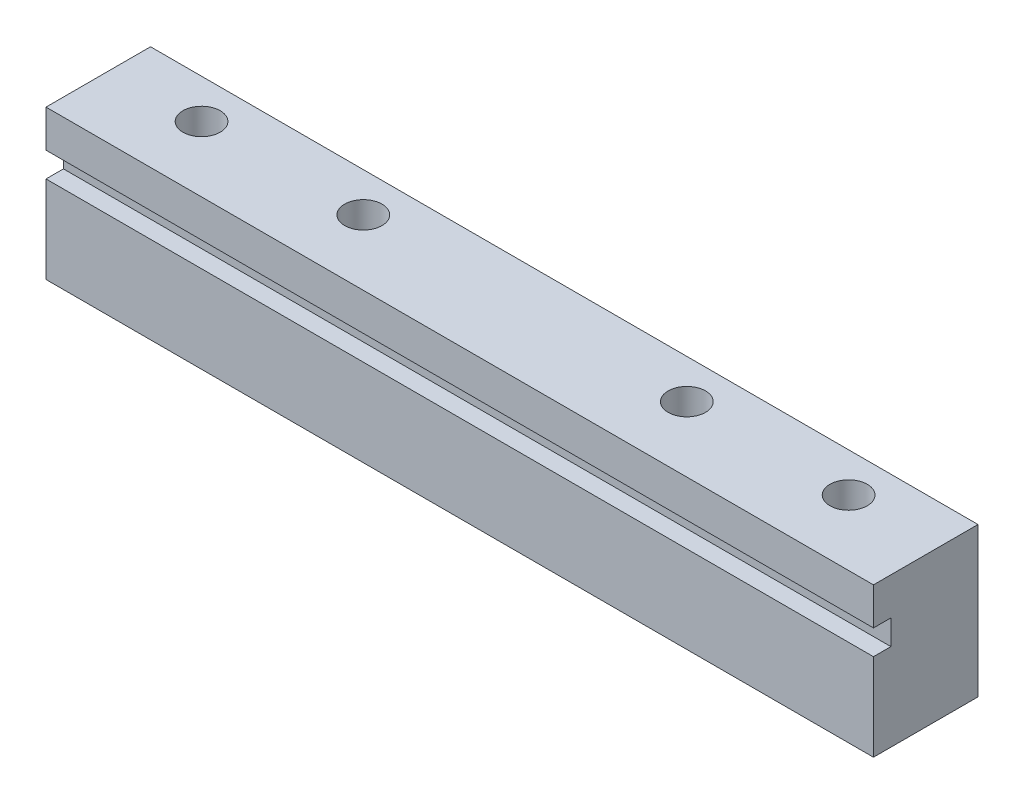
ISO-10303-21;
HEADER;
FILE_DESCRIPTION(('STEP AP214'),'2;1');
FILE_NAME('part.step','',(''),(''),'','','');
FILE_SCHEMA(('AUTOMOTIVE_DESIGN { 1 0 10303 214 1 1 1 1 }'));
ENDSEC;
DATA;
#1=APPLICATION_CONTEXT('core data for automotive mechanical design processes');
#2=APPLICATION_PROTOCOL_DEFINITION('international standard','automotive_design',2000,#1);
#3=PRODUCT_CONTEXT('',#1,'mechanical');
#4=PRODUCT('Part','Part','',(#3));
#5=PRODUCT_RELATED_PRODUCT_CATEGORY('part','',(#4));
#6=PRODUCT_DEFINITION_FORMATION('','',#4);
#7=PRODUCT_DEFINITION_CONTEXT('part definition',#1,'design');
#8=PRODUCT_DEFINITION('design','',#6,#7);
#9=PRODUCT_DEFINITION_SHAPE('','',#8);
#10=(LENGTH_UNIT() NAMED_UNIT(*) SI_UNIT(.MILLI.,.METRE.));
#11=(NAMED_UNIT(*) PLANE_ANGLE_UNIT() SI_UNIT($,.RADIAN.));
#12=(NAMED_UNIT(*) SI_UNIT($,.STERADIAN.) SOLID_ANGLE_UNIT());
#13=UNCERTAINTY_MEASURE_WITH_UNIT(LENGTH_MEASURE(1.E-05),#10,'distance_accuracy_value','');
#14=(GEOMETRIC_REPRESENTATION_CONTEXT(3) GLOBAL_UNCERTAINTY_ASSIGNED_CONTEXT((#13)) GLOBAL_UNIT_ASSIGNED_CONTEXT((#10,
#11,#12)) REPRESENTATION_CONTEXT('',''));
#15=CARTESIAN_POINT('',(0.,0.,0.));
#16=DIRECTION('',(0.,0.,1.));
#17=DIRECTION('',(1.,0.,0.));
#18=AXIS2_PLACEMENT_3D('',#15,#16,#17);
#19=CARTESIAN_POINT('',(-33.2500000000002,12.,4.2));
#20=DIRECTION('',(0.,0.,-1.));
#21=DIRECTION('',(-1.,0.,0.));
#22=AXIS2_PLACEMENT_3D('',#19,#20,#21);
#23=PLANE('',#22);
#24=DIRECTION('',(0.,-1.,0.));
#25=VECTOR('',#24,1.);
#26=CARTESIAN_POINT('',(-33.2500000000002,12.,4.2));
#27=LINE('',#26,#25);
#28=CARTESIAN_POINT('',(-33.2500000000002,12.,4.2));
#29=VERTEX_POINT('',#28);
#30=CARTESIAN_POINT('',(-33.2500000000002,9.,4.2));
#31=VERTEX_POINT('',#30);
#32=EDGE_CURVE('E138',#29,#31,#27,.T.);
#33=ORIENTED_EDGE('',*,*,#32,.T.);
#34=DIRECTION('',(1.,0.,0.));
#35=VECTOR('',#34,1.);
#36=CARTESIAN_POINT('',(-33.2500000000002,9.,4.2));
#37=LINE('',#36,#35);
#38=CARTESIAN_POINT('',(33.2499999999998,9.,4.2));
#39=VERTEX_POINT('',#38);
#40=EDGE_CURVE('E45',#31,#39,#37,.T.);
#41=ORIENTED_EDGE('',*,*,#40,.T.);
#42=DIRECTION('',(0.,-1.,0.));
#43=VECTOR('',#42,1.);
#44=CARTESIAN_POINT('',(33.2499999999998,12.,4.2));
#45=LINE('',#44,#43);
#46=CARTESIAN_POINT('',(33.2499999999998,12.,4.2));
#47=VERTEX_POINT('',#46);
#48=EDGE_CURVE('E130',#47,#39,#45,.T.);
#49=ORIENTED_EDGE('',*,*,#48,.F.);
#50=DIRECTION('',(1.,0.,0.));
#51=VECTOR('',#50,1.);
#52=CARTESIAN_POINT('',(-33.2500000000002,12.,4.2));
#53=LINE('',#52,#51);
#54=EDGE_CURVE('E61',#29,#47,#53,.T.);
#55=ORIENTED_EDGE('',*,*,#54,.F.);
#56=EDGE_LOOP('',(#33,#41,#49,#55));
#57=FACE_BOUND('',#56,.T.);
#58=ADVANCED_FACE('F37',(#57),#23,.F.);
#59=CARTESIAN_POINT('',(33.2499999999998,12.,-4.2));
#60=DIRECTION('',(-1.,0.,0.));
#61=DIRECTION('',(0.,0.,1.));
#62=AXIS2_PLACEMENT_3D('',#59,#60,#61);
#63=PLANE('',#62);
#64=ORIENTED_EDGE('',*,*,#48,.T.);
#65=DIRECTION('',(0.,0.,1.));
#66=VECTOR('',#65,1.);
#67=CARTESIAN_POINT('',(33.2499999999998,9.,4.2));
#68=LINE('',#67,#66);
#69=CARTESIAN_POINT('',(33.2499999999998,9.,2.8));
#70=VERTEX_POINT('',#69);
#71=EDGE_CURVE('E150',#70,#39,#68,.T.);
#72=ORIENTED_EDGE('',*,*,#71,.F.);
#73=DIRECTION('',(0.,1.,0.));
#74=VECTOR('',#73,1.);
#75=CARTESIAN_POINT('',(33.2499999999998,9.,2.8));
#76=LINE('',#75,#74);
#77=CARTESIAN_POINT('',(33.2499999999998,7.,2.8));
#78=VERTEX_POINT('',#77);
#79=EDGE_CURVE('E123',#78,#70,#76,.T.);
#80=ORIENTED_EDGE('',*,*,#79,.F.);
#81=DIRECTION('',(0.,0.,-1.));
#82=VECTOR('',#81,1.);
#83=CARTESIAN_POINT('',(33.2499999999998,7.,4.2));
#84=LINE('',#83,#82);
#85=CARTESIAN_POINT('',(33.2499999999998,7.,4.2));
#86=VERTEX_POINT('',#85);
#87=EDGE_CURVE('E114',#86,#78,#84,.T.);
#88=ORIENTED_EDGE('',*,*,#87,.F.);
#89=CARTESIAN_POINT('',(33.2499999999998,0.,4.2));
#90=VERTEX_POINT('',#89);
#91=EDGE_CURVE('E83',#86,#90,#45,.T.);
#92=ORIENTED_EDGE('',*,*,#91,.T.);
#93=DIRECTION('',(0.,0.,-1.));
#94=VECTOR('',#93,1.);
#95=CARTESIAN_POINT('',(33.2499999999998,0.,-4.2));
#96=LINE('',#95,#94);
#97=CARTESIAN_POINT('',(33.2499999999998,0.,-4.2));
#98=VERTEX_POINT('',#97);
#99=EDGE_CURVE('E161',#90,#98,#96,.T.);
#100=ORIENTED_EDGE('',*,*,#99,.T.);
#101=DIRECTION('',(0.,-1.,0.));
#102=VECTOR('',#101,1.);
#103=CARTESIAN_POINT('',(33.2499999999998,12.,-4.2));
#104=LINE('',#103,#102);
#105=CARTESIAN_POINT('',(33.2499999999998,12.,-4.2));
#106=VERTEX_POINT('',#105);
#107=EDGE_CURVE('E118',#106,#98,#104,.T.);
#108=ORIENTED_EDGE('',*,*,#107,.F.);
#109=DIRECTION('',(0.,0.,-1.));
#110=VECTOR('',#109,1.);
#111=CARTESIAN_POINT('',(33.2499999999998,12.,-4.2));
#112=LINE('',#111,#110);
#113=EDGE_CURVE('E152',#47,#106,#112,.T.);
#114=ORIENTED_EDGE('',*,*,#113,.F.);
#115=EDGE_LOOP('',(#64,#72,#80,#88,#92,#100,#108,#114));
#116=FACE_BOUND('',#115,.T.);
#117=ADVANCED_FACE('F39',(#116),#63,.F.);
#118=CARTESIAN_POINT('',(-33.2500000000002,12.,-4.2));
#119=DIRECTION('',(0.,0.,1.));
#120=DIRECTION('',(1.,0.,0.));
#121=AXIS2_PLACEMENT_3D('',#118,#119,#120);
#122=PLANE('',#121);
#123=DIRECTION('',(-1.,0.,0.));
#124=VECTOR('',#123,1.);
#125=CARTESIAN_POINT('',(-33.2500000000002,0.,-4.2));
#126=LINE('',#125,#124);
#127=CARTESIAN_POINT('',(-33.2500000000002,0.,-4.2));
#128=VERTEX_POINT('',#127);
#129=EDGE_CURVE('E163',#98,#128,#126,.T.);
#130=ORIENTED_EDGE('',*,*,#129,.T.);
#131=DIRECTION('',(0.,-1.,0.));
#132=VECTOR('',#131,1.);
#133=CARTESIAN_POINT('',(-33.2500000000002,12.,-4.2));
#134=LINE('',#133,#132);
#135=CARTESIAN_POINT('',(-33.2500000000002,12.,-4.2));
#136=VERTEX_POINT('',#135);
#137=EDGE_CURVE('E141',#136,#128,#134,.T.);
#138=ORIENTED_EDGE('',*,*,#137,.F.);
#139=DIRECTION('',(-1.,0.,0.));
#140=VECTOR('',#139,1.);
#141=CARTESIAN_POINT('',(-33.2500000000002,12.,-4.2));
#142=LINE('',#141,#140);
#143=EDGE_CURVE('E91',#106,#136,#142,.T.);
#144=ORIENTED_EDGE('',*,*,#143,.F.);
#145=ORIENTED_EDGE('',*,*,#107,.T.);
#146=EDGE_LOOP('',(#130,#138,#144,#145));
#147=FACE_BOUND('',#146,.T.);
#148=ADVANCED_FACE('F171',(#147),#122,.F.);
#149=CARTESIAN_POINT('',(-33.2500000000002,12.,-4.2));
#150=DIRECTION('',(1.,0.,0.));
#151=DIRECTION('',(0.,0.,-1.));
#152=AXIS2_PLACEMENT_3D('',#149,#150,#151);
#153=PLANE('',#152);
#154=DIRECTION('',(0.,1.,0.));
#155=VECTOR('',#154,1.);
#156=CARTESIAN_POINT('',(-33.2500000000002,12.,2.8));
#157=LINE('',#156,#155);
#158=CARTESIAN_POINT('',(-33.2500000000002,7.,2.8));
#159=VERTEX_POINT('',#158);
#160=CARTESIAN_POINT('',(-33.2500000000002,9.,2.8));
#161=VERTEX_POINT('',#160);
#162=EDGE_CURVE('E11',#159,#161,#157,.T.);
#163=ORIENTED_EDGE('',*,*,#162,.T.);
#164=DIRECTION('',(0.,0.,1.));
#165=VECTOR('',#164,1.);
#166=CARTESIAN_POINT('',(-33.2500000000002,9.,-4.2));
#167=LINE('',#166,#165);
#168=EDGE_CURVE('E157',#161,#31,#167,.T.);
#169=ORIENTED_EDGE('',*,*,#168,.T.);
#170=ORIENTED_EDGE('',*,*,#32,.F.);
#171=DIRECTION('',(0.,0.,1.));
#172=VECTOR('',#171,1.);
#173=CARTESIAN_POINT('',(-33.2500000000002,12.,-4.2));
#174=LINE('',#173,#172);
#175=EDGE_CURVE('E133',#136,#29,#174,.T.);
#176=ORIENTED_EDGE('',*,*,#175,.F.);
#177=ORIENTED_EDGE('',*,*,#137,.T.);
#178=DIRECTION('',(0.,0.,1.));
#179=VECTOR('',#178,1.);
#180=CARTESIAN_POINT('',(-33.2500000000002,0.,-4.2));
#181=LINE('',#180,#179);
#182=CARTESIAN_POINT('',(-33.2500000000002,0.,4.2));
#183=VERTEX_POINT('',#182);
#184=EDGE_CURVE('E155',#128,#183,#181,.T.);
#185=ORIENTED_EDGE('',*,*,#184,.T.);
#186=CARTESIAN_POINT('',(-33.2500000000002,7.,4.2));
#187=VERTEX_POINT('',#186);
#188=EDGE_CURVE('E132',#187,#183,#27,.T.);
#189=ORIENTED_EDGE('',*,*,#188,.F.);
#190=DIRECTION('',(0.,0.,-1.));
#191=VECTOR('',#190,1.);
#192=CARTESIAN_POINT('',(-33.2500000000002,7.,-4.2));
#193=LINE('',#192,#191);
#194=EDGE_CURVE('E52',#187,#159,#193,.T.);
#195=ORIENTED_EDGE('',*,*,#194,.T.);
#196=EDGE_LOOP('',(#163,#169,#170,#176,#177,#185,#189,#195));
#197=FACE_BOUND('',#196,.T.);
#198=ADVANCED_FACE('F167',(#197),#153,.F.);
#199=ORIENTED_EDGE('',*,*,#91,.F.);
#200=DIRECTION('',(-1.,0.,0.));
#201=VECTOR('',#200,1.);
#202=CARTESIAN_POINT('',(-33.2500000000002,7.,4.2));
#203=LINE('',#202,#201);
#204=EDGE_CURVE('E112',#86,#187,#203,.T.);
#205=ORIENTED_EDGE('',*,*,#204,.T.);
#206=ORIENTED_EDGE('',*,*,#188,.T.);
#207=DIRECTION('',(1.,0.,0.));
#208=VECTOR('',#207,1.);
#209=CARTESIAN_POINT('',(-33.2500000000002,0.,4.2));
#210=LINE('',#209,#208);
#211=EDGE_CURVE('E128',#183,#90,#210,.T.);
#212=ORIENTED_EDGE('',*,*,#211,.T.);
#213=EDGE_LOOP('',(#199,#205,#206,#212));
#214=FACE_BOUND('',#213,.T.);
#215=ADVANCED_FACE('F126',(#214),#23,.F.);
#216=CARTESIAN_POINT('',(0.,12.,0.));
#217=DIRECTION('',(0.,1.,0.));
#218=DIRECTION('',(0.,0.,1.));
#219=AXIS2_PLACEMENT_3D('',#216,#217,#218);
#220=PLANE('',#219);
#221=CARTESIAN_POINT('',(-26.0000000000002,12.,-1.05));
#222=DIRECTION('',(0.,-1.,0.));
#223=DIRECTION('',(0.,0.,-1.));
#224=AXIS2_PLACEMENT_3D('',#221,#222,#223);
#225=CIRCLE('',#224,1.5);
#226=CARTESIAN_POINT('',(-26.0000000000002,12.,-2.55));
#227=VERTEX_POINT('',#226);
#228=EDGE_CURVE('E124',#227,#227,#225,.T.);
#229=ORIENTED_EDGE('',*,*,#228,.T.);
#230=EDGE_LOOP('',(#229));
#231=FACE_BOUND('',#230,.T.);
#232=CARTESIAN_POINT('',(12.9999999999998,12.,-1.05));
#233=DIRECTION('',(0.,-1.,0.));
#234=DIRECTION('',(0.,0.,-1.));
#235=AXIS2_PLACEMENT_3D('',#232,#233,#234);
#236=CIRCLE('',#235,1.5);
#237=CARTESIAN_POINT('',(12.9999999999998,12.,-2.55));
#238=VERTEX_POINT('',#237);
#239=EDGE_CURVE('E235',#238,#238,#236,.T.);
#240=ORIENTED_EDGE('',*,*,#239,.T.);
#241=EDGE_LOOP('',(#240));
#242=FACE_BOUND('',#241,.T.);
#243=CARTESIAN_POINT('',(25.9999999999998,12.,-1.04999999999999));
#244=DIRECTION('',(0.,-1.,0.));
#245=DIRECTION('',(0.,0.,-1.));
#246=AXIS2_PLACEMENT_3D('',#243,#244,#245);
#247=CIRCLE('',#246,1.5);
#248=CARTESIAN_POINT('',(25.9999999999998,12.,-2.54999999999999));
#249=VERTEX_POINT('',#248);
#250=EDGE_CURVE('E244',#249,#249,#247,.T.);
#251=ORIENTED_EDGE('',*,*,#250,.T.);
#252=EDGE_LOOP('',(#251));
#253=FACE_BOUND('',#252,.T.);
#254=CARTESIAN_POINT('',(-13.0000000000002,12.,-1.05));
#255=DIRECTION('',(0.,-1.,0.));
#256=DIRECTION('',(0.,0.,-1.));
#257=AXIS2_PLACEMENT_3D('',#254,#255,#256);
#258=CIRCLE('',#257,1.5);
#259=CARTESIAN_POINT('',(-13.0000000000002,12.,-2.55));
#260=VERTEX_POINT('',#259);
#261=EDGE_CURVE('E228',#260,#260,#258,.T.);
#262=ORIENTED_EDGE('',*,*,#261,.T.);
#263=EDGE_LOOP('',(#262));
#264=FACE_BOUND('',#263,.T.);
#265=ORIENTED_EDGE('',*,*,#113,.T.);
#266=ORIENTED_EDGE('',*,*,#143,.T.);
#267=ORIENTED_EDGE('',*,*,#175,.T.);
#268=ORIENTED_EDGE('',*,*,#54,.T.);
#269=EDGE_LOOP('',(#265,#266,#267,#268));
#270=FACE_BOUND('',#269,.T.);
#271=ADVANCED_FACE('F184',(#231,#242,#253,#264,#270),#220,.T.);
#272=CARTESIAN_POINT('',(0.,0.,0.));
#273=DIRECTION('',(0.,1.,0.));
#274=DIRECTION('',(0.,0.,1.));
#275=AXIS2_PLACEMENT_3D('',#272,#273,#274);
#276=PLANE('',#275);
#277=CARTESIAN_POINT('',(-26.0000000000002,0.,-1.05));
#278=DIRECTION('',(0.,-1.,0.));
#279=DIRECTION('',(0.,0.,-1.));
#280=AXIS2_PLACEMENT_3D('',#277,#278,#279);
#281=CIRCLE('',#280,1.5);
#282=CARTESIAN_POINT('',(-26.0000000000002,0.,-2.55));
#283=VERTEX_POINT('',#282);
#284=EDGE_CURVE('E227',#283,#283,#281,.T.);
#285=ORIENTED_EDGE('',*,*,#284,.F.);
#286=EDGE_LOOP('',(#285));
#287=FACE_BOUND('',#286,.T.);
#288=CARTESIAN_POINT('',(12.9999999999998,0.,-1.05));
#289=DIRECTION('',(0.,-1.,0.));
#290=DIRECTION('',(0.,0.,-1.));
#291=AXIS2_PLACEMENT_3D('',#288,#289,#290);
#292=CIRCLE('',#291,1.5);
#293=CARTESIAN_POINT('',(12.9999999999998,0.,-2.55));
#294=VERTEX_POINT('',#293);
#295=EDGE_CURVE('E239',#294,#294,#292,.T.);
#296=ORIENTED_EDGE('',*,*,#295,.F.);
#297=EDGE_LOOP('',(#296));
#298=FACE_BOUND('',#297,.T.);
#299=CARTESIAN_POINT('',(25.9999999999998,0.,-1.04999999999999));
#300=DIRECTION('',(0.,-1.,0.));
#301=DIRECTION('',(0.,0.,-1.));
#302=AXIS2_PLACEMENT_3D('',#299,#300,#301);
#303=CIRCLE('',#302,1.5);
#304=CARTESIAN_POINT('',(25.9999999999998,0.,-2.54999999999999));
#305=VERTEX_POINT('',#304);
#306=EDGE_CURVE('E238',#305,#305,#303,.T.);
#307=ORIENTED_EDGE('',*,*,#306,.F.);
#308=EDGE_LOOP('',(#307));
#309=FACE_BOUND('',#308,.T.);
#310=CARTESIAN_POINT('',(-13.0000000000002,0.,-1.05));
#311=DIRECTION('',(0.,-1.,0.));
#312=DIRECTION('',(0.,0.,-1.));
#313=AXIS2_PLACEMENT_3D('',#310,#311,#312);
#314=CIRCLE('',#313,1.5);
#315=CARTESIAN_POINT('',(-13.0000000000002,0.,-2.55));
#316=VERTEX_POINT('',#315);
#317=EDGE_CURVE('E232',#316,#316,#314,.T.);
#318=ORIENTED_EDGE('',*,*,#317,.F.);
#319=EDGE_LOOP('',(#318));
#320=FACE_BOUND('',#319,.T.);
#321=ORIENTED_EDGE('',*,*,#99,.F.);
#322=ORIENTED_EDGE('',*,*,#211,.F.);
#323=ORIENTED_EDGE('',*,*,#184,.F.);
#324=ORIENTED_EDGE('',*,*,#129,.F.);
#325=EDGE_LOOP('',(#321,#322,#323,#324));
#326=FACE_BOUND('',#325,.T.);
#327=ADVANCED_FACE('F170',(#287,#298,#309,#320,#326),#276,.F.);
#328=CARTESIAN_POINT('',(-70.7500000000002,9.,2.8));
#329=DIRECTION('',(0.,0.,-1.));
#330=DIRECTION('',(-1.,0.,0.));
#331=AXIS2_PLACEMENT_3D('',#328,#329,#330);
#332=PLANE('',#331);
#333=DIRECTION('',(1.,0.,0.));
#334=VECTOR('',#333,1.);
#335=CARTESIAN_POINT('',(-70.7500000000002,7.,2.8));
#336=LINE('',#335,#334);
#337=EDGE_CURVE('E251',#159,#78,#336,.T.);
#338=ORIENTED_EDGE('',*,*,#337,.T.);
#339=ORIENTED_EDGE('',*,*,#79,.T.);
#340=DIRECTION('',(1.,0.,0.));
#341=VECTOR('',#340,1.);
#342=CARTESIAN_POINT('',(-70.7500000000002,9.,2.8));
#343=LINE('',#342,#341);
#344=EDGE_CURVE('E252',#161,#70,#343,.T.);
#345=ORIENTED_EDGE('',*,*,#344,.F.);
#346=ORIENTED_EDGE('',*,*,#162,.F.);
#347=EDGE_LOOP('',(#338,#339,#345,#346));
#348=FACE_BOUND('',#347,.T.);
#349=ADVANCED_FACE('F193',(#348),#332,.F.);
#350=CARTESIAN_POINT('',(-70.7500000000002,9.,4.2));
#351=DIRECTION('',(0.,1.,0.));
#352=DIRECTION('',(0.,0.,1.));
#353=AXIS2_PLACEMENT_3D('',#350,#351,#352);
#354=PLANE('',#353);
#355=ORIENTED_EDGE('',*,*,#344,.T.);
#356=ORIENTED_EDGE('',*,*,#71,.T.);
#357=ORIENTED_EDGE('',*,*,#40,.F.);
#358=ORIENTED_EDGE('',*,*,#168,.F.);
#359=EDGE_LOOP('',(#355,#356,#357,#358));
#360=FACE_BOUND('',#359,.T.);
#361=ADVANCED_FACE('F201',(#360),#354,.F.);
#362=CARTESIAN_POINT('',(-70.7500000000002,7.,4.2));
#363=DIRECTION('',(0.,-1.,0.));
#364=DIRECTION('',(0.,0.,-1.));
#365=AXIS2_PLACEMENT_3D('',#362,#363,#364);
#366=PLANE('',#365);
#367=ORIENTED_EDGE('',*,*,#204,.F.);
#368=ORIENTED_EDGE('',*,*,#87,.T.);
#369=ORIENTED_EDGE('',*,*,#337,.F.);
#370=ORIENTED_EDGE('',*,*,#194,.F.);
#371=EDGE_LOOP('',(#367,#368,#369,#370));
#372=FACE_BOUND('',#371,.T.);
#373=ADVANCED_FACE('F113',(#372),#366,.F.);
#374=CARTESIAN_POINT('',(-13.0000000000002,12.,-1.05));
#375=DIRECTION('',(0.,-1.,0.));
#376=DIRECTION('',(0.,0.,-1.));
#377=AXIS2_PLACEMENT_3D('',#374,#375,#376);
#378=CYLINDRICAL_SURFACE('',#377,1.5);
#379=ORIENTED_EDGE('',*,*,#261,.F.);
#380=EDGE_LOOP('',(#379));
#381=FACE_BOUND('',#380,.T.);
#382=ORIENTED_EDGE('',*,*,#317,.T.);
#383=EDGE_LOOP('',(#382));
#384=FACE_BOUND('',#383,.T.);
#385=ADVANCED_FACE('F200',(#381,#384),#378,.F.);
#386=CARTESIAN_POINT('',(25.9999999999998,12.,-1.04999999999999));
#387=DIRECTION('',(0.,-1.,0.));
#388=DIRECTION('',(0.,0.,-1.));
#389=AXIS2_PLACEMENT_3D('',#386,#387,#388);
#390=CYLINDRICAL_SURFACE('',#389,1.5);
#391=ORIENTED_EDGE('',*,*,#250,.F.);
#392=EDGE_LOOP('',(#391));
#393=FACE_BOUND('',#392,.T.);
#394=ORIENTED_EDGE('',*,*,#306,.T.);
#395=EDGE_LOOP('',(#394));
#396=FACE_BOUND('',#395,.T.);
#397=ADVANCED_FACE('F207',(#393,#396),#390,.F.);
#398=CARTESIAN_POINT('',(12.9999999999998,12.,-1.05));
#399=DIRECTION('',(0.,-1.,0.));
#400=DIRECTION('',(0.,0.,-1.));
#401=AXIS2_PLACEMENT_3D('',#398,#399,#400);
#402=CYLINDRICAL_SURFACE('',#401,1.5);
#403=ORIENTED_EDGE('',*,*,#239,.F.);
#404=EDGE_LOOP('',(#403));
#405=FACE_BOUND('',#404,.T.);
#406=ORIENTED_EDGE('',*,*,#295,.T.);
#407=EDGE_LOOP('',(#406));
#408=FACE_BOUND('',#407,.T.);
#409=ADVANCED_FACE('F210',(#405,#408),#402,.F.);
#410=CARTESIAN_POINT('',(-26.0000000000002,12.,-1.05));
#411=DIRECTION('',(0.,-1.,0.));
#412=DIRECTION('',(0.,0.,-1.));
#413=AXIS2_PLACEMENT_3D('',#410,#411,#412);
#414=CYLINDRICAL_SURFACE('',#413,1.5);
#415=ORIENTED_EDGE('',*,*,#228,.F.);
#416=EDGE_LOOP('',(#415));
#417=FACE_BOUND('',#416,.T.);
#418=ORIENTED_EDGE('',*,*,#284,.T.);
#419=EDGE_LOOP('',(#418));
#420=FACE_BOUND('',#419,.T.);
#421=ADVANCED_FACE('F217',(#417,#420),#414,.F.);
#422=CLOSED_SHELL('',(#58,#117,#148,#198,#215,#271,#327,#349,#361,#373,#385,#397,#409,#421));
#423=MANIFOLD_SOLID_BREP('B2',#422);
#424=ADVANCED_BREP_SHAPE_REPRESENTATION('',(#18,#423),#14);
#425=SHAPE_DEFINITION_REPRESENTATION(#9,#424);
ENDSEC;
END-ISO-10303-21;
